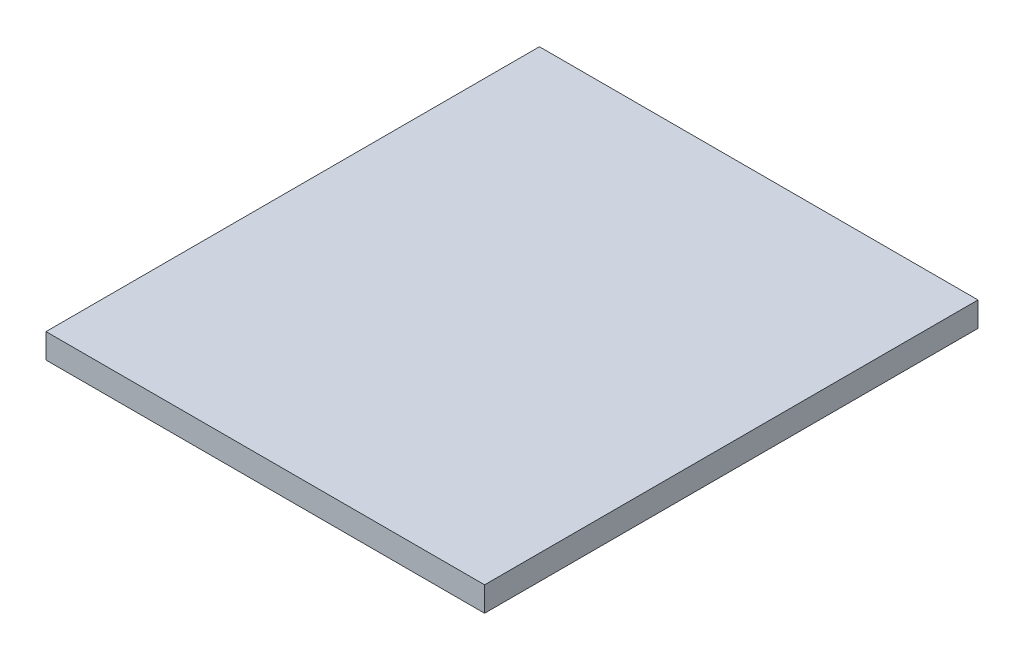
ISO-10303-21;
HEADER;
FILE_DESCRIPTION(('STEP AP214'),'2;1');
FILE_NAME('part.step','',(''),(''),'','','');
FILE_SCHEMA(('AUTOMOTIVE_DESIGN { 1 0 10303 214 1 1 1 1 }'));
ENDSEC;
DATA;
#1=APPLICATION_CONTEXT('core data for automotive mechanical design processes');
#2=APPLICATION_PROTOCOL_DEFINITION('international standard','automotive_design',2000,#1);
#3=PRODUCT_CONTEXT('',#1,'mechanical');
#4=PRODUCT('Part','Part','',(#3));
#5=PRODUCT_RELATED_PRODUCT_CATEGORY('part','',(#4));
#6=PRODUCT_DEFINITION_FORMATION('','',#4);
#7=PRODUCT_DEFINITION_CONTEXT('part definition',#1,'design');
#8=PRODUCT_DEFINITION('design','',#6,#7);
#9=PRODUCT_DEFINITION_SHAPE('','',#8);
#10=(LENGTH_UNIT() NAMED_UNIT(*) SI_UNIT(.MILLI.,.METRE.));
#11=(NAMED_UNIT(*) PLANE_ANGLE_UNIT() SI_UNIT($,.RADIAN.));
#12=(NAMED_UNIT(*) SI_UNIT($,.STERADIAN.) SOLID_ANGLE_UNIT());
#13=UNCERTAINTY_MEASURE_WITH_UNIT(LENGTH_MEASURE(1.E-05),#10,'distance_accuracy_value','');
#14=(GEOMETRIC_REPRESENTATION_CONTEXT(3) GLOBAL_UNCERTAINTY_ASSIGNED_CONTEXT((#13)) GLOBAL_UNIT_ASSIGNED_CONTEXT((#10,
#11,#12)) REPRESENTATION_CONTEXT('',''));
#15=CARTESIAN_POINT('',(0.,0.,0.));
#16=DIRECTION('',(0.,0.,1.));
#17=DIRECTION('',(1.,0.,0.));
#18=AXIS2_PLACEMENT_3D('',#15,#16,#17);
#19=CARTESIAN_POINT('',(-80.,4.5,-90.));
#20=DIRECTION('',(1.,0.,0.));
#21=DIRECTION('',(0.,0.,-1.));
#22=AXIS2_PLACEMENT_3D('',#19,#20,#21);
#23=PLANE('',#22);
#24=DIRECTION('',(0.,0.,1.));
#25=VECTOR('',#24,1.);
#26=CARTESIAN_POINT('',(-80.,-4.5,-90.));
#27=LINE('',#26,#25);
#28=CARTESIAN_POINT('',(-80.,-4.5,-90.));
#29=VERTEX_POINT('',#28);
#30=CARTESIAN_POINT('',(-80.,-4.5,90.));
#31=VERTEX_POINT('',#30);
#32=EDGE_CURVE('E98',#29,#31,#27,.T.);
#33=ORIENTED_EDGE('',*,*,#32,.T.);
#34=DIRECTION('',(0.,-1.,0.));
#35=VECTOR('',#34,1.);
#36=CARTESIAN_POINT('',(-80.,4.5,90.));
#37=LINE('',#36,#35);
#38=CARTESIAN_POINT('',(-80.,4.5,90.));
#39=VERTEX_POINT('',#38);
#40=EDGE_CURVE('E11',#39,#31,#37,.T.);
#41=ORIENTED_EDGE('',*,*,#40,.F.);
#42=DIRECTION('',(0.,0.,1.));
#43=VECTOR('',#42,1.);
#44=CARTESIAN_POINT('',(-80.,4.5,-90.));
#45=LINE('',#44,#43);
#46=CARTESIAN_POINT('',(-80.,4.5,-90.));
#47=VERTEX_POINT('',#46);
#48=EDGE_CURVE('E86',#47,#39,#45,.T.);
#49=ORIENTED_EDGE('',*,*,#48,.F.);
#50=DIRECTION('',(0.,-1.,0.));
#51=VECTOR('',#50,1.);
#52=CARTESIAN_POINT('',(-80.,4.5,-90.));
#53=LINE('',#52,#51);
#54=EDGE_CURVE('E94',#47,#29,#53,.T.);
#55=ORIENTED_EDGE('',*,*,#54,.T.);
#56=EDGE_LOOP('',(#33,#41,#49,#55));
#57=FACE_BOUND('',#56,.T.);
#58=ADVANCED_FACE('F35',(#57),#23,.F.);
#59=CARTESIAN_POINT('',(-80.,4.5,90.));
#60=DIRECTION('',(0.,0.,-1.));
#61=DIRECTION('',(-1.,0.,0.));
#62=AXIS2_PLACEMENT_3D('',#59,#60,#61);
#63=PLANE('',#62);
#64=DIRECTION('',(1.,0.,0.));
#65=VECTOR('',#64,1.);
#66=CARTESIAN_POINT('',(-80.,-4.5,90.));
#67=LINE('',#66,#65);
#68=CARTESIAN_POINT('',(80.,-4.5,90.));
#69=VERTEX_POINT('',#68);
#70=EDGE_CURVE('E90',#31,#69,#67,.T.);
#71=ORIENTED_EDGE('',*,*,#70,.T.);
#72=DIRECTION('',(0.,-1.,0.));
#73=VECTOR('',#72,1.);
#74=CARTESIAN_POINT('',(80.,4.5,90.));
#75=LINE('',#74,#73);
#76=CARTESIAN_POINT('',(80.,4.5,90.));
#77=VERTEX_POINT('',#76);
#78=EDGE_CURVE('E43',#77,#69,#75,.T.);
#79=ORIENTED_EDGE('',*,*,#78,.F.);
#80=DIRECTION('',(1.,0.,0.));
#81=VECTOR('',#80,1.);
#82=CARTESIAN_POINT('',(-80.,4.5,90.));
#83=LINE('',#82,#81);
#84=EDGE_CURVE('E81',#39,#77,#83,.T.);
#85=ORIENTED_EDGE('',*,*,#84,.F.);
#86=ORIENTED_EDGE('',*,*,#40,.T.);
#87=EDGE_LOOP('',(#71,#79,#85,#86));
#88=FACE_BOUND('',#87,.T.);
#89=ADVANCED_FACE('F89',(#88),#63,.F.);
#90=CARTESIAN_POINT('',(80.,4.5,-90.));
#91=DIRECTION('',(-1.,0.,0.));
#92=DIRECTION('',(0.,0.,1.));
#93=AXIS2_PLACEMENT_3D('',#90,#91,#92);
#94=PLANE('',#93);
#95=DIRECTION('',(0.,0.,-1.));
#96=VECTOR('',#95,1.);
#97=CARTESIAN_POINT('',(80.,-4.5,-90.));
#98=LINE('',#97,#96);
#99=CARTESIAN_POINT('',(80.,-4.5,-90.));
#100=VERTEX_POINT('',#99);
#101=EDGE_CURVE('E68',#69,#100,#98,.T.);
#102=ORIENTED_EDGE('',*,*,#101,.T.);
#103=DIRECTION('',(0.,-1.,0.));
#104=VECTOR('',#103,1.);
#105=CARTESIAN_POINT('',(80.,4.5,-90.));
#106=LINE('',#105,#104);
#107=CARTESIAN_POINT('',(80.,4.5,-90.));
#108=VERTEX_POINT('',#107);
#109=EDGE_CURVE('E91',#108,#100,#106,.T.);
#110=ORIENTED_EDGE('',*,*,#109,.F.);
#111=DIRECTION('',(0.,0.,-1.));
#112=VECTOR('',#111,1.);
#113=CARTESIAN_POINT('',(80.,4.5,-90.));
#114=LINE('',#113,#112);
#115=EDGE_CURVE('E84',#77,#108,#114,.T.);
#116=ORIENTED_EDGE('',*,*,#115,.F.);
#117=ORIENTED_EDGE('',*,*,#78,.T.);
#118=EDGE_LOOP('',(#102,#110,#116,#117));
#119=FACE_BOUND('',#118,.T.);
#120=ADVANCED_FACE('F92',(#119),#94,.F.);
#121=CARTESIAN_POINT('',(-80.,4.5,-90.));
#122=DIRECTION('',(0.,0.,1.));
#123=DIRECTION('',(1.,0.,0.));
#124=AXIS2_PLACEMENT_3D('',#121,#122,#123);
#125=PLANE('',#124);
#126=DIRECTION('',(-1.,0.,0.));
#127=VECTOR('',#126,1.);
#128=CARTESIAN_POINT('',(-80.,-4.5,-90.));
#129=LINE('',#128,#127);
#130=EDGE_CURVE('E74',#100,#29,#129,.T.);
#131=ORIENTED_EDGE('',*,*,#130,.T.);
#132=ORIENTED_EDGE('',*,*,#54,.F.);
#133=DIRECTION('',(-1.,0.,0.));
#134=VECTOR('',#133,1.);
#135=CARTESIAN_POINT('',(-80.,4.5,-90.));
#136=LINE('',#135,#134);
#137=EDGE_CURVE('E51',#108,#47,#136,.T.);
#138=ORIENTED_EDGE('',*,*,#137,.F.);
#139=ORIENTED_EDGE('',*,*,#109,.T.);
#140=EDGE_LOOP('',(#131,#132,#138,#139));
#141=FACE_BOUND('',#140,.T.);
#142=ADVANCED_FACE('F105',(#141),#125,.F.);
#143=CARTESIAN_POINT('',(0.,4.5,0.));
#144=DIRECTION('',(0.,1.,0.));
#145=DIRECTION('',(0.,0.,1.));
#146=AXIS2_PLACEMENT_3D('',#143,#144,#145);
#147=PLANE('',#146);
#148=ORIENTED_EDGE('',*,*,#48,.T.);
#149=ORIENTED_EDGE('',*,*,#84,.T.);
#150=ORIENTED_EDGE('',*,*,#115,.T.);
#151=ORIENTED_EDGE('',*,*,#137,.T.);
#152=EDGE_LOOP('',(#148,#149,#150,#151));
#153=FACE_BOUND('',#152,.T.);
#154=ADVANCED_FACE('F82',(#153),#147,.T.);
#155=CARTESIAN_POINT('',(0.,-4.5,0.));
#156=DIRECTION('',(0.,1.,0.));
#157=DIRECTION('',(0.,0.,1.));
#158=AXIS2_PLACEMENT_3D('',#155,#156,#157);
#159=PLANE('',#158);
#160=ORIENTED_EDGE('',*,*,#32,.F.);
#161=ORIENTED_EDGE('',*,*,#130,.F.);
#162=ORIENTED_EDGE('',*,*,#101,.F.);
#163=ORIENTED_EDGE('',*,*,#70,.F.);
#164=EDGE_LOOP('',(#160,#161,#162,#163));
#165=FACE_BOUND('',#164,.T.);
#166=ADVANCED_FACE('F108',(#165),#159,.F.);
#167=CLOSED_SHELL('',(#58,#89,#120,#142,#154,#166));
#168=MANIFOLD_SOLID_BREP('B2',#167);
#169=ADVANCED_BREP_SHAPE_REPRESENTATION('',(#18,#168),#14);
#170=SHAPE_DEFINITION_REPRESENTATION(#9,#169);
ENDSEC;
END-ISO-10303-21;
